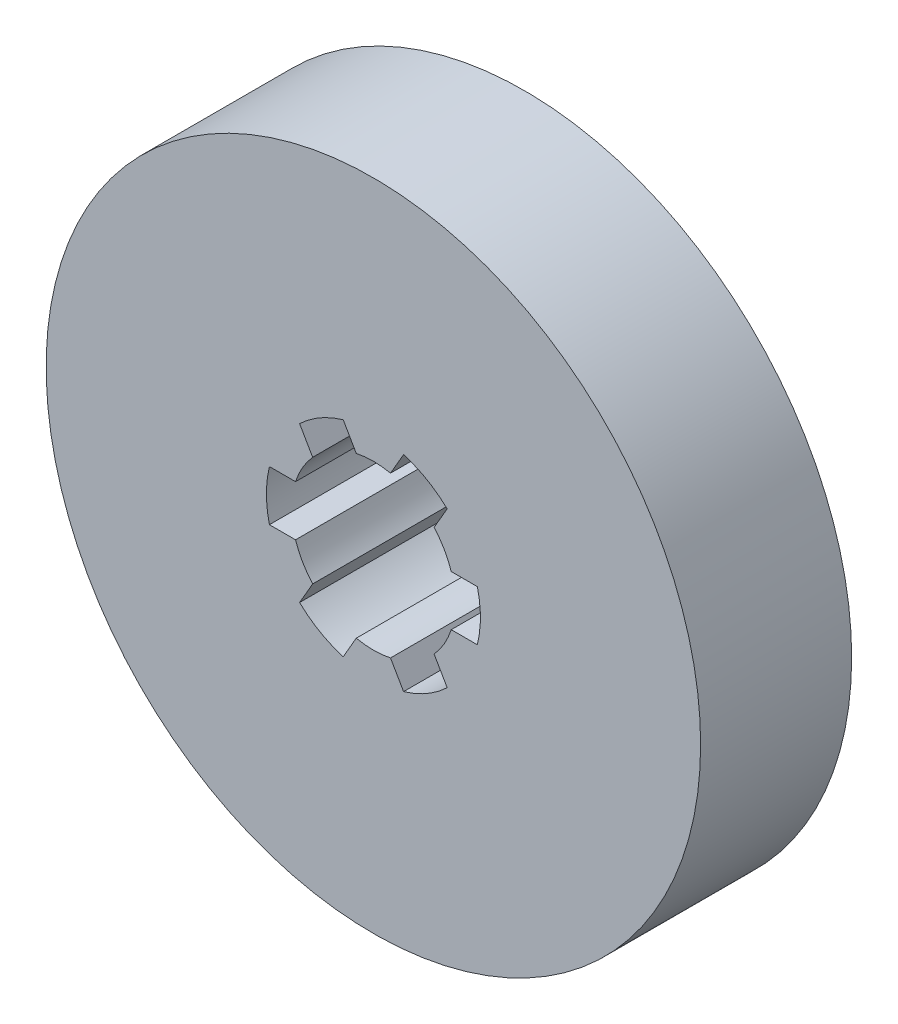
ISO-10303-21;
HEADER;
FILE_DESCRIPTION(('STEP AP214'),'2;1');
FILE_NAME('part.step','',(''),(''),'','','');
FILE_SCHEMA(('AUTOMOTIVE_DESIGN { 1 0 10303 214 1 1 1 1 }'));
ENDSEC;
DATA;
#1=APPLICATION_CONTEXT('core data for automotive mechanical design processes');
#2=APPLICATION_PROTOCOL_DEFINITION('international standard','automotive_design',2000,#1);
#3=PRODUCT_CONTEXT('',#1,'mechanical');
#4=PRODUCT('Part','Part','',(#3));
#5=PRODUCT_RELATED_PRODUCT_CATEGORY('part','',(#4));
#6=PRODUCT_DEFINITION_FORMATION('','',#4);
#7=PRODUCT_DEFINITION_CONTEXT('part definition',#1,'design');
#8=PRODUCT_DEFINITION('design','',#6,#7);
#9=PRODUCT_DEFINITION_SHAPE('','',#8);
#10=(LENGTH_UNIT() NAMED_UNIT(*) SI_UNIT(.MILLI.,.METRE.));
#11=(NAMED_UNIT(*) PLANE_ANGLE_UNIT() SI_UNIT($,.RADIAN.));
#12=(NAMED_UNIT(*) SI_UNIT($,.STERADIAN.) SOLID_ANGLE_UNIT());
#13=UNCERTAINTY_MEASURE_WITH_UNIT(LENGTH_MEASURE(1.E-05),#10,'distance_accuracy_value','');
#14=(GEOMETRIC_REPRESENTATION_CONTEXT(3) GLOBAL_UNCERTAINTY_ASSIGNED_CONTEXT((#13)) GLOBAL_UNIT_ASSIGNED_CONTEXT((#10,
#11,#12)) REPRESENTATION_CONTEXT('',''));
#15=CARTESIAN_POINT('',(0.,0.,0.));
#16=DIRECTION('',(0.,0.,1.));
#17=DIRECTION('',(1.,0.,0.));
#18=AXIS2_PLACEMENT_3D('',#15,#16,#17);
#19=CARTESIAN_POINT('',(0.,0.,12.));
#20=DIRECTION('',(0.,0.,1.));
#21=DIRECTION('',(1.,0.,0.));
#22=AXIS2_PLACEMENT_3D('',#19,#20,#21);
#23=PLANE('',#22);
#24=CARTESIAN_POINT('',(0.,0.,12.));
#25=DIRECTION('',(0.,0.,1.));
#26=DIRECTION('',(1.,0.,0.));
#27=AXIS2_PLACEMENT_3D('',#24,#25,#26);
#28=CIRCLE('',#27,26.);
#29=CARTESIAN_POINT('',(26.,0.,12.));
#30=VERTEX_POINT('',#29);
#31=EDGE_CURVE('E10',#30,#30,#28,.T.);
#32=ORIENTED_EDGE('',*,*,#31,.T.);
#33=EDGE_LOOP('',(#32));
#34=FACE_BOUND('',#33,.T.);
#35=CARTESIAN_POINT('',(1.41538913929051E-05,0.000114129818460512,12.));
#36=DIRECTION('',(0.,0.,1.));
#37=DIRECTION('',(1.,0.,0.));
#38=AXIS2_PLACEMENT_3D('',#35,#36,#37);
#39=CIRCLE('',#38,6.5);
#40=CARTESIAN_POINT('',(1.36029256553576,6.35618545122562,12.));
#41=VERTEX_POINT('',#40);
#42=CARTESIAN_POINT('',(-1.36026425775297,6.35618545122562,12.));
#43=VERTEX_POINT('',#42);
#44=EDGE_CURVE('E423',#41,#43,#39,.T.);
#45=ORIENTED_EDGE('',*,*,#44,.F.);
#46=DIRECTION('',(0.5,0.866025403784439,0.));
#47=VECTOR('',#46,1.);
#48=CARTESIAN_POINT('',(1.87946691116143,7.2554217958356,12.));
#49=LINE('',#48,#47);
#50=CARTESIAN_POINT('',(2.3986412567871,8.15465814044558,12.));
#51=VERTEX_POINT('',#50);
#52=EDGE_CURVE('E233',#41,#51,#49,.T.);
#53=ORIENTED_EDGE('',*,*,#52,.T.);
#54=CARTESIAN_POINT('',(1.4153891405265E-05,0.000114129818509518,12.));
#55=DIRECTION('',(0.,0.,1.));
#56=DIRECTION('',(1.,0.,0.));
#57=AXIS2_PLACEMENT_3D('',#54,#55,#56);
#58=CIRCLE('',#57,8.5);
#59=CARTESIAN_POINT('',(5.86274287192485,6.15465814044558,12.));
#60=VERTEX_POINT('',#59);
#61=EDGE_CURVE('E351',#60,#51,#58,.T.);
#62=ORIENTED_EDGE('',*,*,#61,.F.);
#63=DIRECTION('',(0.5,0.866025403784439,0.));
#64=VECTOR('',#63,1.);
#65=CARTESIAN_POINT('',(5.34356852629918,5.2554217958356,12.));
#66=LINE('',#65,#64);
#67=CARTESIAN_POINT('',(4.82439418067351,4.35618545122562,12.));
#68=VERTEX_POINT('',#67);
#69=EDGE_CURVE('E37',#68,#60,#66,.T.);
#70=ORIENTED_EDGE('',*,*,#69,.F.);
#71=CARTESIAN_POINT('',(1.41538913857493E-05,0.000114129818478944,12.));
#72=DIRECTION('',(0.,0.,1.));
#73=DIRECTION('',(1.,0.,0.));
#74=AXIS2_PLACEMENT_3D('',#71,#72,#73);
#75=CIRCLE('',#74,6.5);
#76=CARTESIAN_POINT('',(6.18467259231788,2.00011412981848,12.));
#77=VERTEX_POINT('',#76);
#78=EDGE_CURVE('E419',#77,#68,#75,.T.);
#79=ORIENTED_EDGE('',*,*,#78,.F.);
#80=DIRECTION('',(1.,0.,0.));
#81=VECTOR('',#80,1.);
#82=CARTESIAN_POINT('',(7.22302128356921,2.00011412981848,12.));
#83=LINE('',#82,#81);
#84=CARTESIAN_POINT('',(8.26136997482055,2.00011412981848,12.));
#85=VERTEX_POINT('',#84);
#86=EDGE_CURVE('E403',#77,#85,#83,.T.);
#87=ORIENTED_EDGE('',*,*,#86,.T.);
#88=CARTESIAN_POINT('',(1.41538913844483E-05,0.000114129818484581,12.));
#89=DIRECTION('',(0.,0.,1.));
#90=DIRECTION('',(1.,0.,0.));
#91=AXIS2_PLACEMENT_3D('',#88,#89,#90);
#92=CIRCLE('',#91,8.5);
#93=CARTESIAN_POINT('',(8.26136997482055,-1.99988587018151,12.));
#94=VERTEX_POINT('',#93);
#95=EDGE_CURVE('E411',#94,#85,#92,.T.);
#96=ORIENTED_EDGE('',*,*,#95,.F.);
#97=DIRECTION('',(1.,0.,0.));
#98=VECTOR('',#97,1.);
#99=CARTESIAN_POINT('',(7.22302128356921,-1.99988587018151,12.));
#100=LINE('',#99,#98);
#101=CARTESIAN_POINT('',(6.18467259231788,-1.99988587018151,12.));
#102=VERTEX_POINT('',#101);
#103=EDGE_CURVE('E407',#102,#94,#100,.T.);
#104=ORIENTED_EDGE('',*,*,#103,.F.);
#105=CARTESIAN_POINT('',(1.41538913853156E-05,0.000114129818493038,12.));
#106=DIRECTION('',(0.,0.,1.));
#107=DIRECTION('',(1.,0.,0.));
#108=AXIS2_PLACEMENT_3D('',#105,#106,#107);
#109=CIRCLE('',#108,6.5);
#110=CARTESIAN_POINT('',(4.82439418067352,-4.35595719158865,12.));
#111=VERTEX_POINT('',#110);
#112=EDGE_CURVE('E415',#111,#102,#109,.T.);
#113=ORIENTED_EDGE('',*,*,#112,.F.);
#114=DIRECTION('',(0.5,-0.866025403784439,0.));
#115=VECTOR('',#114,1.);
#116=CARTESIAN_POINT('',(5.34356852629918,-5.25519353619863,12.));
#117=LINE('',#116,#115);
#118=CARTESIAN_POINT('',(5.86274287192485,-6.15442988080861,12.));
#119=VERTEX_POINT('',#118);
#120=EDGE_CURVE('E399',#111,#119,#117,.T.);
#121=ORIENTED_EDGE('',*,*,#120,.T.);
#122=CARTESIAN_POINT('',(1.41538914030966E-05,0.000114129818468318,12.));
#123=DIRECTION('',(0.,0.,1.));
#124=DIRECTION('',(1.,0.,0.));
#125=AXIS2_PLACEMENT_3D('',#122,#123,#124);
#126=CIRCLE('',#125,8.5);
#127=CARTESIAN_POINT('',(2.39864125678709,-8.15442988080861,12.));
#128=VERTEX_POINT('',#127);
#129=EDGE_CURVE('E395',#128,#119,#126,.T.);
#130=ORIENTED_EDGE('',*,*,#129,.F.);
#131=DIRECTION('',(0.5,-0.866025403784439,0.));
#132=VECTOR('',#131,1.);
#133=CARTESIAN_POINT('',(1.87946691116143,-7.25519353619863,12.));
#134=LINE('',#133,#132);
#135=CARTESIAN_POINT('',(1.36029256553576,-6.35595719158865,12.));
#136=VERTEX_POINT('',#135);
#137=EDGE_CURVE('E391',#136,#128,#134,.T.);
#138=ORIENTED_EDGE('',*,*,#137,.F.);
#139=CARTESIAN_POINT('',(1.41538913914956E-05,0.000114129818493038,12.));
#140=DIRECTION('',(0.,0.,1.));
#141=DIRECTION('',(1.,0.,0.));
#142=AXIS2_PLACEMENT_3D('',#139,#140,#141);
#143=CIRCLE('',#142,6.5);
#144=CARTESIAN_POINT('',(-1.36026425775298,-6.35595719158865,12.));
#145=VERTEX_POINT('',#144);
#146=EDGE_CURVE('E257',#145,#136,#143,.T.);
#147=ORIENTED_EDGE('',*,*,#146,.F.);
#148=DIRECTION('',(-0.5,-0.866025403784439,0.));
#149=VECTOR('',#148,1.);
#150=CARTESIAN_POINT('',(-1.87943860337864,-7.25519353619863,12.));
#151=LINE('',#150,#149);
#152=CARTESIAN_POINT('',(-2.39861294900431,-8.15442988080861,12.));
#153=VERTEX_POINT('',#152);
#154=EDGE_CURVE('E379',#145,#153,#151,.T.);
#155=ORIENTED_EDGE('',*,*,#154,.T.);
#156=CARTESIAN_POINT('',(1.41538913814125E-05,0.000114129818462247,12.));
#157=DIRECTION('',(0.,0.,1.));
#158=DIRECTION('',(1.,0.,0.));
#159=AXIS2_PLACEMENT_3D('',#156,#157,#158);
#160=CIRCLE('',#159,8.5);
#161=CARTESIAN_POINT('',(-5.86271456414206,-6.15442988080861,12.));
#162=VERTEX_POINT('',#161);
#163=EDGE_CURVE('E387',#162,#153,#160,.T.);
#164=ORIENTED_EDGE('',*,*,#163,.F.);
#165=DIRECTION('',(-0.5,-0.866025403784439,0.));
#166=VECTOR('',#165,1.);
#167=CARTESIAN_POINT('',(-5.3435402185164,-5.25519353619863,12.));
#168=LINE('',#167,#166);
#169=CARTESIAN_POINT('',(-4.82436587289073,-4.35595719158865,12.));
#170=VERTEX_POINT('',#169);
#171=EDGE_CURVE('E383',#170,#162,#168,.T.);
#172=ORIENTED_EDGE('',*,*,#171,.F.);
#173=CARTESIAN_POINT('',(1.41538913610295E-05,0.000114129818467017,12.));
#174=DIRECTION('',(0.,0.,1.));
#175=DIRECTION('',(1.,0.,0.));
#176=AXIS2_PLACEMENT_3D('',#173,#174,#175);
#177=CIRCLE('',#176,6.5);
#178=CARTESIAN_POINT('',(-6.1846442845351,-1.99988587018151,12.));
#179=VERTEX_POINT('',#178);
#180=EDGE_CURVE('E266',#179,#170,#177,.T.);
#181=ORIENTED_EDGE('',*,*,#180,.F.);
#182=DIRECTION('',(-1.,0.,0.));
#183=VECTOR('',#182,1.);
#184=CARTESIAN_POINT('',(-7.22299297578643,-1.99988587018151,12.));
#185=LINE('',#184,#183);
#186=CARTESIAN_POINT('',(-8.26134166703776,-1.99988587018151,12.));
#187=VERTEX_POINT('',#186);
#188=EDGE_CURVE('E375',#179,#187,#185,.T.);
#189=ORIENTED_EDGE('',*,*,#188,.T.);
#190=CARTESIAN_POINT('',(1.41538913714378E-05,0.000114129818484148,12.));
#191=DIRECTION('',(0.,0.,1.));
#192=DIRECTION('',(1.,0.,0.));
#193=AXIS2_PLACEMENT_3D('',#190,#191,#192);
#194=CIRCLE('',#193,8.5);
#195=CARTESIAN_POINT('',(-8.26134166703776,2.00011412981848,12.));
#196=VERTEX_POINT('',#195);
#197=EDGE_CURVE('E371',#196,#187,#194,.T.);
#198=ORIENTED_EDGE('',*,*,#197,.F.);
#199=DIRECTION('',(-1.,0.,0.));
#200=VECTOR('',#199,1.);
#201=CARTESIAN_POINT('',(-7.22299297578643,2.00011412981848,12.));
#202=LINE('',#201,#200);
#203=CARTESIAN_POINT('',(-6.1846442845351,2.00011412981848,12.));
#204=VERTEX_POINT('',#203);
#205=EDGE_CURVE('E367',#204,#196,#202,.T.);
#206=ORIENTED_EDGE('',*,*,#205,.F.);
#207=CARTESIAN_POINT('',(1.4153891375341E-05,0.000114129818493255,12.));
#208=DIRECTION('',(0.,0.,1.));
#209=DIRECTION('',(1.,0.,0.));
#210=AXIS2_PLACEMENT_3D('',#207,#208,#209);
#211=CIRCLE('',#210,6.5);
#212=CARTESIAN_POINT('',(-4.82436587289073,4.35618545122562,12.));
#213=VERTEX_POINT('',#212);
#214=EDGE_CURVE('E426',#213,#204,#211,.T.);
#215=ORIENTED_EDGE('',*,*,#214,.F.);
#216=DIRECTION('',(-0.5,0.866025403784439,0.));
#217=VECTOR('',#216,1.);
#218=CARTESIAN_POINT('',(-5.3435402185164,5.2554217958356,12.));
#219=LINE('',#218,#217);
#220=CARTESIAN_POINT('',(-5.86271456414206,6.15465814044558,12.));
#221=VERTEX_POINT('',#220);
#222=EDGE_CURVE('E355',#213,#221,#219,.T.);
#223=ORIENTED_EDGE('',*,*,#222,.T.);
#224=CARTESIAN_POINT('',(1.41538913857493E-05,0.00011412981849564,12.));
#225=DIRECTION('',(0.,0.,1.));
#226=DIRECTION('',(1.,0.,0.));
#227=AXIS2_PLACEMENT_3D('',#224,#225,#226);
#228=CIRCLE('',#227,8.5);
#229=CARTESIAN_POINT('',(-2.39861294900431,8.15465814044558,12.));
#230=VERTEX_POINT('',#229);
#231=EDGE_CURVE('E363',#230,#221,#228,.T.);
#232=ORIENTED_EDGE('',*,*,#231,.F.);
#233=DIRECTION('',(-0.5,0.866025403784439,0.));
#234=VECTOR('',#233,1.);
#235=CARTESIAN_POINT('',(-1.87943860337864,7.2554217958356,12.));
#236=LINE('',#235,#234);
#237=EDGE_CURVE('E359',#43,#230,#236,.T.);
#238=ORIENTED_EDGE('',*,*,#237,.F.);
#239=EDGE_LOOP('',(#45,#53,#62,#70,#79,#87,#96,#104,#113,#121,#130,#138,#147,#155,#164,#172,
#181,#189,#198,#206,#215,#223,#232,#238));
#240=FACE_BOUND('',#239,.T.);
#241=ADVANCED_FACE('F16',(#34,#240),#23,.T.);
#242=CARTESIAN_POINT('',(0.,0.,0.));
#243=DIRECTION('',(0.,0.,1.));
#244=DIRECTION('',(1.,0.,0.));
#245=AXIS2_PLACEMENT_3D('',#242,#243,#244);
#246=PLANE('',#245);
#247=CARTESIAN_POINT('',(0.,0.,0.));
#248=DIRECTION('',(0.,0.,1.));
#249=DIRECTION('',(1.,0.,0.));
#250=AXIS2_PLACEMENT_3D('',#247,#248,#249);
#251=CIRCLE('',#250,26.);
#252=CARTESIAN_POINT('',(26.,0.,0.));
#253=VERTEX_POINT('',#252);
#254=EDGE_CURVE('E20',#253,#253,#251,.T.);
#255=ORIENTED_EDGE('',*,*,#254,.F.);
#256=EDGE_LOOP('',(#255));
#257=FACE_BOUND('',#256,.T.);
#258=DIRECTION('',(0.5,0.866025403784439,0.));
#259=VECTOR('',#258,1.);
#260=CARTESIAN_POINT('',(1.87946691116143,7.2554217958356,0.));
#261=LINE('',#260,#259);
#262=CARTESIAN_POINT('',(1.36029256553576,6.35618545122562,0.));
#263=VERTEX_POINT('',#262);
#264=CARTESIAN_POINT('',(2.3986412567871,8.15465814044558,0.));
#265=VERTEX_POINT('',#264);
#266=EDGE_CURVE('E49',#263,#265,#261,.T.);
#267=ORIENTED_EDGE('',*,*,#266,.F.);
#268=CARTESIAN_POINT('',(1.41538913929051E-05,0.000114129818460512,0.));
#269=DIRECTION('',(0.,0.,1.));
#270=DIRECTION('',(1.,0.,0.));
#271=AXIS2_PLACEMENT_3D('',#268,#269,#270);
#272=CIRCLE('',#271,6.5);
#273=CARTESIAN_POINT('',(-1.36026425775297,6.35618545122562,0.));
#274=VERTEX_POINT('',#273);
#275=EDGE_CURVE('E241',#263,#274,#272,.T.);
#276=ORIENTED_EDGE('',*,*,#275,.T.);
#277=DIRECTION('',(-0.5,0.866025403784439,0.));
#278=VECTOR('',#277,1.);
#279=CARTESIAN_POINT('',(-1.87943860337864,7.2554217958356,0.));
#280=LINE('',#279,#278);
#281=CARTESIAN_POINT('',(-2.39861294900431,8.15465814044558,0.));
#282=VERTEX_POINT('',#281);
#283=EDGE_CURVE('E275',#274,#282,#280,.T.);
#284=ORIENTED_EDGE('',*,*,#283,.T.);
#285=CARTESIAN_POINT('',(1.41538913857493E-05,0.00011412981849564,0.));
#286=DIRECTION('',(0.,0.,1.));
#287=DIRECTION('',(1.,0.,0.));
#288=AXIS2_PLACEMENT_3D('',#285,#286,#287);
#289=CIRCLE('',#288,8.5);
#290=CARTESIAN_POINT('',(-5.86271456414206,6.15465814044558,0.));
#291=VERTEX_POINT('',#290);
#292=EDGE_CURVE('E278',#282,#291,#289,.T.);
#293=ORIENTED_EDGE('',*,*,#292,.T.);
#294=DIRECTION('',(-0.5,0.866025403784439,0.));
#295=VECTOR('',#294,1.);
#296=CARTESIAN_POINT('',(-5.3435402185164,5.2554217958356,0.));
#297=LINE('',#296,#295);
#298=CARTESIAN_POINT('',(-4.82436587289073,4.35618545122562,0.));
#299=VERTEX_POINT('',#298);
#300=EDGE_CURVE('E271',#299,#291,#297,.T.);
#301=ORIENTED_EDGE('',*,*,#300,.F.);
#302=CARTESIAN_POINT('',(1.4153891375341E-05,0.000114129818493255,0.));
#303=DIRECTION('',(0.,0.,1.));
#304=DIRECTION('',(1.,0.,0.));
#305=AXIS2_PLACEMENT_3D('',#302,#303,#304);
#306=CIRCLE('',#305,6.5);
#307=CARTESIAN_POINT('',(-6.1846442845351,2.00011412981848,0.));
#308=VERTEX_POINT('',#307);
#309=EDGE_CURVE('E247',#299,#308,#306,.T.);
#310=ORIENTED_EDGE('',*,*,#309,.T.);
#311=DIRECTION('',(-1.,0.,0.));
#312=VECTOR('',#311,1.);
#313=CARTESIAN_POINT('',(-7.22299297578643,2.00011412981848,0.));
#314=LINE('',#313,#312);
#315=CARTESIAN_POINT('',(-8.26134166703776,2.00011412981848,0.));
#316=VERTEX_POINT('',#315);
#317=EDGE_CURVE('E282',#308,#316,#314,.T.);
#318=ORIENTED_EDGE('',*,*,#317,.T.);
#319=CARTESIAN_POINT('',(1.41538913714378E-05,0.000114129818484148,0.));
#320=DIRECTION('',(0.,0.,1.));
#321=DIRECTION('',(1.,0.,0.));
#322=AXIS2_PLACEMENT_3D('',#319,#320,#321);
#323=CIRCLE('',#322,8.5);
#324=CARTESIAN_POINT('',(-8.26134166703776,-1.99988587018151,0.));
#325=VERTEX_POINT('',#324);
#326=EDGE_CURVE('E286',#316,#325,#323,.T.);
#327=ORIENTED_EDGE('',*,*,#326,.T.);
#328=DIRECTION('',(-1.,0.,0.));
#329=VECTOR('',#328,1.);
#330=CARTESIAN_POINT('',(-7.22299297578643,-1.99988587018151,0.));
#331=LINE('',#330,#329);
#332=CARTESIAN_POINT('',(-6.1846442845351,-1.99988587018151,0.));
#333=VERTEX_POINT('',#332);
#334=EDGE_CURVE('E290',#333,#325,#331,.T.);
#335=ORIENTED_EDGE('',*,*,#334,.F.);
#336=CARTESIAN_POINT('',(1.41538913610295E-05,0.000114129818467017,0.));
#337=DIRECTION('',(0.,0.,1.));
#338=DIRECTION('',(1.,0.,0.));
#339=AXIS2_PLACEMENT_3D('',#336,#337,#338);
#340=CIRCLE('',#339,6.5);
#341=CARTESIAN_POINT('',(-4.82436587289073,-4.35595719158865,0.));
#342=VERTEX_POINT('',#341);
#343=EDGE_CURVE('E340',#333,#342,#340,.T.);
#344=ORIENTED_EDGE('',*,*,#343,.T.);
#345=DIRECTION('',(-0.5,-0.866025403784439,0.));
#346=VECTOR('',#345,1.);
#347=CARTESIAN_POINT('',(-5.3435402185164,-5.25519353619863,0.));
#348=LINE('',#347,#346);
#349=CARTESIAN_POINT('',(-5.86271456414206,-6.15442988080861,0.));
#350=VERTEX_POINT('',#349);
#351=EDGE_CURVE('E298',#342,#350,#348,.T.);
#352=ORIENTED_EDGE('',*,*,#351,.T.);
#353=CARTESIAN_POINT('',(1.41538913814125E-05,0.000114129818462247,0.));
#354=DIRECTION('',(0.,0.,1.));
#355=DIRECTION('',(1.,0.,0.));
#356=AXIS2_PLACEMENT_3D('',#353,#354,#355);
#357=CIRCLE('',#356,8.5);
#358=CARTESIAN_POINT('',(-2.39861294900431,-8.15442988080861,0.));
#359=VERTEX_POINT('',#358);
#360=EDGE_CURVE('E302',#350,#359,#357,.T.);
#361=ORIENTED_EDGE('',*,*,#360,.T.);
#362=DIRECTION('',(-0.5,-0.866025403784439,0.));
#363=VECTOR('',#362,1.);
#364=CARTESIAN_POINT('',(-1.87943860337864,-7.25519353619863,0.));
#365=LINE('',#364,#363);
#366=CARTESIAN_POINT('',(-1.36026425775298,-6.35595719158865,0.));
#367=VERTEX_POINT('',#366);
#368=EDGE_CURVE('E294',#367,#359,#365,.T.);
#369=ORIENTED_EDGE('',*,*,#368,.F.);
#370=CARTESIAN_POINT('',(1.41538913914956E-05,0.000114129818493038,0.));
#371=DIRECTION('',(0.,0.,1.));
#372=DIRECTION('',(1.,0.,0.));
#373=AXIS2_PLACEMENT_3D('',#370,#371,#372);
#374=CIRCLE('',#373,6.5);
#375=CARTESIAN_POINT('',(1.36029256553576,-6.35595719158865,0.));
#376=VERTEX_POINT('',#375);
#377=EDGE_CURVE('E344',#367,#376,#374,.T.);
#378=ORIENTED_EDGE('',*,*,#377,.T.);
#379=DIRECTION('',(0.5,-0.866025403784439,0.));
#380=VECTOR('',#379,1.);
#381=CARTESIAN_POINT('',(1.87946691116143,-7.25519353619863,0.));
#382=LINE('',#381,#380);
#383=CARTESIAN_POINT('',(2.39864125678709,-8.15442988080861,0.));
#384=VERTEX_POINT('',#383);
#385=EDGE_CURVE('E306',#376,#384,#382,.T.);
#386=ORIENTED_EDGE('',*,*,#385,.T.);
#387=CARTESIAN_POINT('',(1.41538914030966E-05,0.000114129818468318,0.));
#388=DIRECTION('',(0.,0.,1.));
#389=DIRECTION('',(1.,0.,0.));
#390=AXIS2_PLACEMENT_3D('',#387,#388,#389);
#391=CIRCLE('',#390,8.5);
#392=CARTESIAN_POINT('',(5.86274287192485,-6.15442988080861,0.));
#393=VERTEX_POINT('',#392);
#394=EDGE_CURVE('E310',#384,#393,#391,.T.);
#395=ORIENTED_EDGE('',*,*,#394,.T.);
#396=DIRECTION('',(0.5,-0.866025403784439,0.));
#397=VECTOR('',#396,1.);
#398=CARTESIAN_POINT('',(5.34356852629918,-5.25519353619863,0.));
#399=LINE('',#398,#397);
#400=CARTESIAN_POINT('',(4.82439418067352,-4.35595719158865,0.));
#401=VERTEX_POINT('',#400);
#402=EDGE_CURVE('E314',#401,#393,#399,.T.);
#403=ORIENTED_EDGE('',*,*,#402,.F.);
#404=CARTESIAN_POINT('',(1.41538913853156E-05,0.000114129818493038,0.));
#405=DIRECTION('',(0.,0.,1.));
#406=DIRECTION('',(1.,0.,0.));
#407=AXIS2_PLACEMENT_3D('',#404,#405,#406);
#408=CIRCLE('',#407,6.5);
#409=CARTESIAN_POINT('',(6.18467259231788,-1.99988587018151,0.));
#410=VERTEX_POINT('',#409);
#411=EDGE_CURVE('E330',#401,#410,#408,.T.);
#412=ORIENTED_EDGE('',*,*,#411,.T.);
#413=DIRECTION('',(1.,0.,0.));
#414=VECTOR('',#413,1.);
#415=CARTESIAN_POINT('',(7.22302128356921,-1.99988587018151,0.));
#416=LINE('',#415,#414);
#417=CARTESIAN_POINT('',(8.26136997482055,-1.99988587018151,0.));
#418=VERTEX_POINT('',#417);
#419=EDGE_CURVE('E322',#410,#418,#416,.T.);
#420=ORIENTED_EDGE('',*,*,#419,.T.);
#421=CARTESIAN_POINT('',(1.41538913844483E-05,0.000114129818484581,0.));
#422=DIRECTION('',(0.,0.,1.));
#423=DIRECTION('',(1.,0.,0.));
#424=AXIS2_PLACEMENT_3D('',#421,#422,#423);
#425=CIRCLE('',#424,8.5);
#426=CARTESIAN_POINT('',(8.26136997482055,2.00011412981848,0.));
#427=VERTEX_POINT('',#426);
#428=EDGE_CURVE('E326',#418,#427,#425,.T.);
#429=ORIENTED_EDGE('',*,*,#428,.T.);
#430=DIRECTION('',(1.,0.,0.));
#431=VECTOR('',#430,1.);
#432=CARTESIAN_POINT('',(7.22302128356921,2.00011412981848,0.));
#433=LINE('',#432,#431);
#434=CARTESIAN_POINT('',(6.18467259231788,2.00011412981848,0.));
#435=VERTEX_POINT('',#434);
#436=EDGE_CURVE('E318',#435,#427,#433,.T.);
#437=ORIENTED_EDGE('',*,*,#436,.F.);
#438=CARTESIAN_POINT('',(1.41538913857493E-05,0.000114129818478944,0.));
#439=DIRECTION('',(0.,0.,1.));
#440=DIRECTION('',(1.,0.,0.));
#441=AXIS2_PLACEMENT_3D('',#438,#439,#440);
#442=CIRCLE('',#441,6.5);
#443=CARTESIAN_POINT('',(4.82439418067351,4.35618545122562,0.));
#444=VERTEX_POINT('',#443);
#445=EDGE_CURVE('E248',#435,#444,#442,.T.);
#446=ORIENTED_EDGE('',*,*,#445,.T.);
#447=DIRECTION('',(0.5,0.866025403784439,0.));
#448=VECTOR('',#447,1.);
#449=CARTESIAN_POINT('',(5.34356852629918,5.2554217958356,0.));
#450=LINE('',#449,#448);
#451=CARTESIAN_POINT('',(5.86274287192485,6.15465814044558,0.));
#452=VERTEX_POINT('',#451);
#453=EDGE_CURVE('E256',#444,#452,#450,.T.);
#454=ORIENTED_EDGE('',*,*,#453,.T.);
#455=CARTESIAN_POINT('',(1.4153891405265E-05,0.000114129818509518,0.));
#456=DIRECTION('',(0.,0.,1.));
#457=DIRECTION('',(1.,0.,0.));
#458=AXIS2_PLACEMENT_3D('',#455,#456,#457);
#459=CIRCLE('',#458,8.5);
#460=EDGE_CURVE('E254',#452,#265,#459,.T.);
#461=ORIENTED_EDGE('',*,*,#460,.T.);
#462=EDGE_LOOP('',(#267,#276,#284,#293,#301,#310,#318,#327,#335,#344,#352,#361,#369,#378,#386,
#395,#403,#412,#420,#429,#437,#446,#454,#461));
#463=FACE_BOUND('',#462,.T.);
#464=ADVANCED_FACE('F251',(#257,#463),#246,.F.);
#465=CARTESIAN_POINT('',(0.,0.,12.));
#466=DIRECTION('',(0.,0.,-1.));
#467=DIRECTION('',(-1.,0.,0.));
#468=AXIS2_PLACEMENT_3D('',#465,#466,#467);
#469=CYLINDRICAL_SURFACE('',#468,26.);
#470=ORIENTED_EDGE('',*,*,#31,.F.);
#471=EDGE_LOOP('',(#470));
#472=FACE_BOUND('',#471,.T.);
#473=ORIENTED_EDGE('',*,*,#254,.T.);
#474=EDGE_LOOP('',(#473));
#475=FACE_BOUND('',#474,.T.);
#476=ADVANCED_FACE('F18',(#472,#475),#469,.T.);
#477=CARTESIAN_POINT('',(1.87946691116143,7.2554217958356,0.));
#478=DIRECTION('',(0.866025403784438,-0.5,0.));
#479=DIRECTION('',(0.5,0.866025403784439,0.));
#480=AXIS2_PLACEMENT_3D('',#477,#478,#479);
#481=PLANE('',#480);
#482=ORIENTED_EDGE('',*,*,#52,.F.);
#483=DIRECTION('',(0.,0.,1.));
#484=VECTOR('',#483,1.);
#485=CARTESIAN_POINT('',(1.36029256553576,6.35618545122562,0.));
#486=LINE('',#485,#484);
#487=EDGE_CURVE('E229',#263,#41,#486,.T.);
#488=ORIENTED_EDGE('',*,*,#487,.F.);
#489=ORIENTED_EDGE('',*,*,#266,.T.);
#490=DIRECTION('',(0.,0.,1.));
#491=VECTOR('',#490,1.);
#492=CARTESIAN_POINT('',(2.3986412567871,8.15465814044558,0.));
#493=LINE('',#492,#491);
#494=EDGE_CURVE('E348',#265,#51,#493,.T.);
#495=ORIENTED_EDGE('',*,*,#494,.T.);
#496=EDGE_LOOP('',(#482,#488,#489,#495));
#497=FACE_BOUND('',#496,.T.);
#498=ADVANCED_FACE('F231',(#497),#481,.T.);
#499=CARTESIAN_POINT('',(1.41538913929051E-05,0.000114129818460512,0.));
#500=DIRECTION('',(0.,0.,1.));
#501=DIRECTION('',(1.,0.,0.));
#502=AXIS2_PLACEMENT_3D('',#499,#500,#501);
#503=CYLINDRICAL_SURFACE('',#502,6.5);
#504=ORIENTED_EDGE('',*,*,#44,.T.);
#505=DIRECTION('',(0.,0.,1.));
#506=VECTOR('',#505,1.);
#507=CARTESIAN_POINT('',(-1.36026425775297,6.35618545122562,0.));
#508=LINE('',#507,#506);
#509=EDGE_CURVE('E238',#274,#43,#508,.T.);
#510=ORIENTED_EDGE('',*,*,#509,.F.);
#511=ORIENTED_EDGE('',*,*,#275,.F.);
#512=ORIENTED_EDGE('',*,*,#487,.T.);
#513=EDGE_LOOP('',(#504,#510,#511,#512));
#514=FACE_BOUND('',#513,.T.);
#515=ADVANCED_FACE('F242',(#514),#503,.F.);
#516=CARTESIAN_POINT('',(-1.87943860337864,7.2554217958356,0.));
#517=DIRECTION('',(0.866025403784439,0.5,0.));
#518=DIRECTION('',(-0.5,0.866025403784439,0.));
#519=AXIS2_PLACEMENT_3D('',#516,#517,#518);
#520=PLANE('',#519);
#521=ORIENTED_EDGE('',*,*,#237,.T.);
#522=DIRECTION('',(0.,0.,1.));
#523=VECTOR('',#522,1.);
#524=CARTESIAN_POINT('',(-2.39861294900431,8.15465814044558,0.));
#525=LINE('',#524,#523);
#526=EDGE_CURVE('E486',#282,#230,#525,.T.);
#527=ORIENTED_EDGE('',*,*,#526,.F.);
#528=ORIENTED_EDGE('',*,*,#283,.F.);
#529=ORIENTED_EDGE('',*,*,#509,.T.);
#530=EDGE_LOOP('',(#521,#527,#528,#529));
#531=FACE_BOUND('',#530,.T.);
#532=ADVANCED_FACE('F584',(#531),#520,.F.);
#533=CARTESIAN_POINT('',(1.41538913857493E-05,0.00011412981849564,0.));
#534=DIRECTION('',(0.,0.,1.));
#535=DIRECTION('',(1.,0.,0.));
#536=AXIS2_PLACEMENT_3D('',#533,#534,#535);
#537=CYLINDRICAL_SURFACE('',#536,8.5);
#538=ORIENTED_EDGE('',*,*,#231,.T.);
#539=DIRECTION('',(0.,0.,1.));
#540=VECTOR('',#539,1.);
#541=CARTESIAN_POINT('',(-5.86271456414206,6.15465814044558,0.));
#542=LINE('',#541,#540);
#543=EDGE_CURVE('E483',#291,#221,#542,.T.);
#544=ORIENTED_EDGE('',*,*,#543,.F.);
#545=ORIENTED_EDGE('',*,*,#292,.F.);
#546=ORIENTED_EDGE('',*,*,#526,.T.);
#547=EDGE_LOOP('',(#538,#544,#545,#546));
#548=FACE_BOUND('',#547,.T.);
#549=ADVANCED_FACE('F582',(#548),#537,.F.);
#550=CARTESIAN_POINT('',(-5.3435402185164,5.2554217958356,0.));
#551=DIRECTION('',(0.866025403784439,0.5,0.));
#552=DIRECTION('',(-0.5,0.866025403784439,0.));
#553=AXIS2_PLACEMENT_3D('',#550,#551,#552);
#554=PLANE('',#553);
#555=ORIENTED_EDGE('',*,*,#222,.F.);
#556=DIRECTION('',(0.,0.,1.));
#557=VECTOR('',#556,1.);
#558=CARTESIAN_POINT('',(-4.82436587289073,4.35618545122562,0.));
#559=LINE('',#558,#557);
#560=EDGE_CURVE('E482',#299,#213,#559,.T.);
#561=ORIENTED_EDGE('',*,*,#560,.F.);
#562=ORIENTED_EDGE('',*,*,#300,.T.);
#563=ORIENTED_EDGE('',*,*,#543,.T.);
#564=EDGE_LOOP('',(#555,#561,#562,#563));
#565=FACE_BOUND('',#564,.T.);
#566=ADVANCED_FACE('F578',(#565),#554,.T.);
#567=CARTESIAN_POINT('',(1.4153891375341E-05,0.000114129818493255,0.));
#568=DIRECTION('',(0.,0.,1.));
#569=DIRECTION('',(1.,0.,0.));
#570=AXIS2_PLACEMENT_3D('',#567,#568,#569);
#571=CYLINDRICAL_SURFACE('',#570,6.5);
#572=ORIENTED_EDGE('',*,*,#214,.T.);
#573=DIRECTION('',(0.,0.,1.));
#574=VECTOR('',#573,1.);
#575=CARTESIAN_POINT('',(-6.1846442845351,2.00011412981848,0.));
#576=LINE('',#575,#574);
#577=EDGE_CURVE('E479',#308,#204,#576,.T.);
#578=ORIENTED_EDGE('',*,*,#577,.F.);
#579=ORIENTED_EDGE('',*,*,#309,.F.);
#580=ORIENTED_EDGE('',*,*,#560,.T.);
#581=EDGE_LOOP('',(#572,#578,#579,#580));
#582=FACE_BOUND('',#581,.T.);
#583=ADVANCED_FACE('F573',(#582),#571,.F.);
#584=CARTESIAN_POINT('',(-7.22299297578643,2.00011412981848,0.));
#585=DIRECTION('',(0.,1.,0.));
#586=DIRECTION('',(0.,0.,1.));
#587=AXIS2_PLACEMENT_3D('',#584,#585,#586);
#588=PLANE('',#587);
#589=ORIENTED_EDGE('',*,*,#205,.T.);
#590=DIRECTION('',(0.,0.,1.));
#591=VECTOR('',#590,1.);
#592=CARTESIAN_POINT('',(-8.26134166703776,2.00011412981848,0.));
#593=LINE('',#592,#591);
#594=EDGE_CURVE('E476',#316,#196,#593,.T.);
#595=ORIENTED_EDGE('',*,*,#594,.F.);
#596=ORIENTED_EDGE('',*,*,#317,.F.);
#597=ORIENTED_EDGE('',*,*,#577,.T.);
#598=EDGE_LOOP('',(#589,#595,#596,#597));
#599=FACE_BOUND('',#598,.T.);
#600=ADVANCED_FACE('F570',(#599),#588,.F.);
#601=CARTESIAN_POINT('',(1.41538913714378E-05,0.000114129818484148,0.));
#602=DIRECTION('',(0.,0.,1.));
#603=DIRECTION('',(1.,0.,0.));
#604=AXIS2_PLACEMENT_3D('',#601,#602,#603);
#605=CYLINDRICAL_SURFACE('',#604,8.5);
#606=ORIENTED_EDGE('',*,*,#197,.T.);
#607=DIRECTION('',(0.,0.,1.));
#608=VECTOR('',#607,1.);
#609=CARTESIAN_POINT('',(-8.26134166703776,-1.99988587018151,0.));
#610=LINE('',#609,#608);
#611=EDGE_CURVE('E473',#325,#187,#610,.T.);
#612=ORIENTED_EDGE('',*,*,#611,.F.);
#613=ORIENTED_EDGE('',*,*,#326,.F.);
#614=ORIENTED_EDGE('',*,*,#594,.T.);
#615=EDGE_LOOP('',(#606,#612,#613,#614));
#616=FACE_BOUND('',#615,.T.);
#617=ADVANCED_FACE('F566',(#616),#605,.F.);
#618=CARTESIAN_POINT('',(-7.22299297578643,-1.99988587018151,0.));
#619=DIRECTION('',(0.,1.,0.));
#620=DIRECTION('',(0.,0.,1.));
#621=AXIS2_PLACEMENT_3D('',#618,#619,#620);
#622=PLANE('',#621);
#623=ORIENTED_EDGE('',*,*,#188,.F.);
#624=DIRECTION('',(0.,0.,1.));
#625=VECTOR('',#624,1.);
#626=CARTESIAN_POINT('',(-6.1846442845351,-1.99988587018151,0.));
#627=LINE('',#626,#625);
#628=EDGE_CURVE('E468',#333,#179,#627,.T.);
#629=ORIENTED_EDGE('',*,*,#628,.F.);
#630=ORIENTED_EDGE('',*,*,#334,.T.);
#631=ORIENTED_EDGE('',*,*,#611,.T.);
#632=EDGE_LOOP('',(#623,#629,#630,#631));
#633=FACE_BOUND('',#632,.T.);
#634=ADVANCED_FACE('F561',(#633),#622,.T.);
#635=CARTESIAN_POINT('',(1.41538913610295E-05,0.000114129818467017,0.));
#636=DIRECTION('',(0.,0.,1.));
#637=DIRECTION('',(1.,0.,0.));
#638=AXIS2_PLACEMENT_3D('',#635,#636,#637);
#639=CYLINDRICAL_SURFACE('',#638,6.5);
#640=ORIENTED_EDGE('',*,*,#180,.T.);
#641=DIRECTION('',(0.,0.,1.));
#642=VECTOR('',#641,1.);
#643=CARTESIAN_POINT('',(-4.82436587289073,-4.35595719158865,0.));
#644=LINE('',#643,#642);
#645=EDGE_CURVE('E465',#342,#170,#644,.T.);
#646=ORIENTED_EDGE('',*,*,#645,.F.);
#647=ORIENTED_EDGE('',*,*,#343,.F.);
#648=ORIENTED_EDGE('',*,*,#628,.T.);
#649=EDGE_LOOP('',(#640,#646,#647,#648));
#650=FACE_BOUND('',#649,.T.);
#651=ADVANCED_FACE('F557',(#650),#639,.F.);
#652=CARTESIAN_POINT('',(-5.3435402185164,-5.25519353619863,0.));
#653=DIRECTION('',(-0.866025403784438,0.5,0.));
#654=DIRECTION('',(-0.5,-0.866025403784439,0.));
#655=AXIS2_PLACEMENT_3D('',#652,#653,#654);
#656=PLANE('',#655);
#657=ORIENTED_EDGE('',*,*,#171,.T.);
#658=DIRECTION('',(0.,0.,1.));
#659=VECTOR('',#658,1.);
#660=CARTESIAN_POINT('',(-5.86271456414206,-6.15442988080861,0.));
#661=LINE('',#660,#659);
#662=EDGE_CURVE('E462',#350,#162,#661,.T.);
#663=ORIENTED_EDGE('',*,*,#662,.F.);
#664=ORIENTED_EDGE('',*,*,#351,.F.);
#665=ORIENTED_EDGE('',*,*,#645,.T.);
#666=EDGE_LOOP('',(#657,#663,#664,#665));
#667=FACE_BOUND('',#666,.T.);
#668=ADVANCED_FACE('F553',(#667),#656,.F.);
#669=CARTESIAN_POINT('',(1.41538913814125E-05,0.000114129818462247,0.));
#670=DIRECTION('',(0.,0.,1.));
#671=DIRECTION('',(1.,0.,0.));
#672=AXIS2_PLACEMENT_3D('',#669,#670,#671);
#673=CYLINDRICAL_SURFACE('',#672,8.5);
#674=ORIENTED_EDGE('',*,*,#163,.T.);
#675=DIRECTION('',(0.,0.,1.));
#676=VECTOR('',#675,1.);
#677=CARTESIAN_POINT('',(-2.39861294900431,-8.15442988080861,0.));
#678=LINE('',#677,#676);
#679=EDGE_CURVE('E459',#359,#153,#678,.T.);
#680=ORIENTED_EDGE('',*,*,#679,.F.);
#681=ORIENTED_EDGE('',*,*,#360,.F.);
#682=ORIENTED_EDGE('',*,*,#662,.T.);
#683=EDGE_LOOP('',(#674,#680,#681,#682));
#684=FACE_BOUND('',#683,.T.);
#685=ADVANCED_FACE('F549',(#684),#673,.F.);
#686=CARTESIAN_POINT('',(-1.87943860337864,-7.25519353619863,0.));
#687=DIRECTION('',(-0.866025403784438,0.5,0.));
#688=DIRECTION('',(-0.5,-0.866025403784439,0.));
#689=AXIS2_PLACEMENT_3D('',#686,#687,#688);
#690=PLANE('',#689);
#691=ORIENTED_EDGE('',*,*,#154,.F.);
#692=DIRECTION('',(0.,0.,1.));
#693=VECTOR('',#692,1.);
#694=CARTESIAN_POINT('',(-1.36026425775298,-6.35595719158865,0.));
#695=LINE('',#694,#693);
#696=EDGE_CURVE('E458',#367,#145,#695,.T.);
#697=ORIENTED_EDGE('',*,*,#696,.F.);
#698=ORIENTED_EDGE('',*,*,#368,.T.);
#699=ORIENTED_EDGE('',*,*,#679,.T.);
#700=EDGE_LOOP('',(#691,#697,#698,#699));
#701=FACE_BOUND('',#700,.T.);
#702=ADVANCED_FACE('F546',(#701),#690,.T.);
#703=CARTESIAN_POINT('',(1.41538913914956E-05,0.000114129818493038,0.));
#704=DIRECTION('',(0.,0.,1.));
#705=DIRECTION('',(1.,0.,0.));
#706=AXIS2_PLACEMENT_3D('',#703,#704,#705);
#707=CYLINDRICAL_SURFACE('',#706,6.5);
#708=ORIENTED_EDGE('',*,*,#146,.T.);
#709=DIRECTION('',(0.,0.,1.));
#710=VECTOR('',#709,1.);
#711=CARTESIAN_POINT('',(1.36029256553576,-6.35595719158865,0.));
#712=LINE('',#711,#710);
#713=EDGE_CURVE('E455',#376,#136,#712,.T.);
#714=ORIENTED_EDGE('',*,*,#713,.F.);
#715=ORIENTED_EDGE('',*,*,#377,.F.);
#716=ORIENTED_EDGE('',*,*,#696,.T.);
#717=EDGE_LOOP('',(#708,#714,#715,#716));
#718=FACE_BOUND('',#717,.T.);
#719=ADVANCED_FACE('F542',(#718),#707,.F.);
#720=CARTESIAN_POINT('',(1.87946691116143,-7.25519353619863,0.));
#721=DIRECTION('',(-0.866025403784438,-0.5,0.));
#722=DIRECTION('',(0.5,-0.866025403784439,0.));
#723=AXIS2_PLACEMENT_3D('',#720,#721,#722);
#724=PLANE('',#723);
#725=ORIENTED_EDGE('',*,*,#137,.T.);
#726=DIRECTION('',(0.,0.,1.));
#727=VECTOR('',#726,1.);
#728=CARTESIAN_POINT('',(2.39864125678709,-8.15442988080861,0.));
#729=LINE('',#728,#727);
#730=EDGE_CURVE('E452',#384,#128,#729,.T.);
#731=ORIENTED_EDGE('',*,*,#730,.F.);
#732=ORIENTED_EDGE('',*,*,#385,.F.);
#733=ORIENTED_EDGE('',*,*,#713,.T.);
#734=EDGE_LOOP('',(#725,#731,#732,#733));
#735=FACE_BOUND('',#734,.T.);
#736=ADVANCED_FACE('F537',(#735),#724,.F.);
#737=CARTESIAN_POINT('',(1.41538914030966E-05,0.000114129818468318,0.));
#738=DIRECTION('',(0.,0.,1.));
#739=DIRECTION('',(1.,0.,0.));
#740=AXIS2_PLACEMENT_3D('',#737,#738,#739);
#741=CYLINDRICAL_SURFACE('',#740,8.5);
#742=ORIENTED_EDGE('',*,*,#129,.T.);
#743=DIRECTION('',(0.,0.,1.));
#744=VECTOR('',#743,1.);
#745=CARTESIAN_POINT('',(5.86274287192485,-6.15442988080861,0.));
#746=LINE('',#745,#744);
#747=EDGE_CURVE('E449',#393,#119,#746,.T.);
#748=ORIENTED_EDGE('',*,*,#747,.F.);
#749=ORIENTED_EDGE('',*,*,#394,.F.);
#750=ORIENTED_EDGE('',*,*,#730,.T.);
#751=EDGE_LOOP('',(#742,#748,#749,#750));
#752=FACE_BOUND('',#751,.T.);
#753=ADVANCED_FACE('F534',(#752),#741,.F.);
#754=CARTESIAN_POINT('',(5.34356852629918,-5.25519353619863,0.));
#755=DIRECTION('',(-0.866025403784438,-0.5,0.));
#756=DIRECTION('',(0.5,-0.866025403784439,0.));
#757=AXIS2_PLACEMENT_3D('',#754,#755,#756);
#758=PLANE('',#757);
#759=ORIENTED_EDGE('',*,*,#120,.F.);
#760=DIRECTION('',(0.,0.,1.));
#761=VECTOR('',#760,1.);
#762=CARTESIAN_POINT('',(4.82439418067352,-4.35595719158865,0.));
#763=LINE('',#762,#761);
#764=EDGE_CURVE('E443',#401,#111,#763,.T.);
#765=ORIENTED_EDGE('',*,*,#764,.F.);
#766=ORIENTED_EDGE('',*,*,#402,.T.);
#767=ORIENTED_EDGE('',*,*,#747,.T.);
#768=EDGE_LOOP('',(#759,#765,#766,#767));
#769=FACE_BOUND('',#768,.T.);
#770=ADVANCED_FACE('F530',(#769),#758,.T.);
#771=CARTESIAN_POINT('',(1.41538913853156E-05,0.000114129818493038,0.));
#772=DIRECTION('',(0.,0.,1.));
#773=DIRECTION('',(1.,0.,0.));
#774=AXIS2_PLACEMENT_3D('',#771,#772,#773);
#775=CYLINDRICAL_SURFACE('',#774,6.5);
#776=ORIENTED_EDGE('',*,*,#112,.T.);
#777=DIRECTION('',(0.,0.,1.));
#778=VECTOR('',#777,1.);
#779=CARTESIAN_POINT('',(6.18467259231788,-1.99988587018151,0.));
#780=LINE('',#779,#778);
#781=EDGE_CURVE('E440',#410,#102,#780,.T.);
#782=ORIENTED_EDGE('',*,*,#781,.F.);
#783=ORIENTED_EDGE('',*,*,#411,.F.);
#784=ORIENTED_EDGE('',*,*,#764,.T.);
#785=EDGE_LOOP('',(#776,#782,#783,#784));
#786=FACE_BOUND('',#785,.T.);
#787=ADVANCED_FACE('F525',(#786),#775,.F.);
#788=CARTESIAN_POINT('',(7.22302128356921,-1.99988587018151,0.));
#789=DIRECTION('',(0.,-1.,0.));
#790=DIRECTION('',(0.,0.,-1.));
#791=AXIS2_PLACEMENT_3D('',#788,#789,#790);
#792=PLANE('',#791);
#793=ORIENTED_EDGE('',*,*,#103,.T.);
#794=DIRECTION('',(0.,0.,1.));
#795=VECTOR('',#794,1.);
#796=CARTESIAN_POINT('',(8.26136997482055,-1.99988587018151,0.));
#797=LINE('',#796,#795);
#798=EDGE_CURVE('E436',#418,#94,#797,.T.);
#799=ORIENTED_EDGE('',*,*,#798,.F.);
#800=ORIENTED_EDGE('',*,*,#419,.F.);
#801=ORIENTED_EDGE('',*,*,#781,.T.);
#802=EDGE_LOOP('',(#793,#799,#800,#801));
#803=FACE_BOUND('',#802,.T.);
#804=ADVANCED_FACE('F522',(#803),#792,.F.);
#805=CARTESIAN_POINT('',(1.41538913844483E-05,0.000114129818484581,0.));
#806=DIRECTION('',(0.,0.,1.));
#807=DIRECTION('',(1.,0.,0.));
#808=AXIS2_PLACEMENT_3D('',#805,#806,#807);
#809=CYLINDRICAL_SURFACE('',#808,8.5);
#810=ORIENTED_EDGE('',*,*,#95,.T.);
#811=DIRECTION('',(0.,0.,1.));
#812=VECTOR('',#811,1.);
#813=CARTESIAN_POINT('',(8.26136997482055,2.00011412981848,0.));
#814=LINE('',#813,#812);
#815=EDGE_CURVE('E433',#427,#85,#814,.T.);
#816=ORIENTED_EDGE('',*,*,#815,.F.);
#817=ORIENTED_EDGE('',*,*,#428,.F.);
#818=ORIENTED_EDGE('',*,*,#798,.T.);
#819=EDGE_LOOP('',(#810,#816,#817,#818));
#820=FACE_BOUND('',#819,.T.);
#821=ADVANCED_FACE('F519',(#820),#809,.F.);
#822=CARTESIAN_POINT('',(7.22302128356921,2.00011412981848,0.));
#823=DIRECTION('',(0.,-1.,0.));
#824=DIRECTION('',(0.,0.,-1.));
#825=AXIS2_PLACEMENT_3D('',#822,#823,#824);
#826=PLANE('',#825);
#827=ORIENTED_EDGE('',*,*,#86,.F.);
#828=DIRECTION('',(0.,0.,1.));
#829=VECTOR('',#828,1.);
#830=CARTESIAN_POINT('',(6.18467259231788,2.00011412981848,0.));
#831=LINE('',#830,#829);
#832=EDGE_CURVE('E437',#435,#77,#831,.T.);
#833=ORIENTED_EDGE('',*,*,#832,.F.);
#834=ORIENTED_EDGE('',*,*,#436,.T.);
#835=ORIENTED_EDGE('',*,*,#815,.T.);
#836=EDGE_LOOP('',(#827,#833,#834,#835));
#837=FACE_BOUND('',#836,.T.);
#838=ADVANCED_FACE('F514',(#837),#826,.T.);
#839=CARTESIAN_POINT('',(1.41538913857493E-05,0.000114129818478944,0.));
#840=DIRECTION('',(0.,0.,1.));
#841=DIRECTION('',(1.,0.,0.));
#842=AXIS2_PLACEMENT_3D('',#839,#840,#841);
#843=CYLINDRICAL_SURFACE('',#842,6.5);
#844=ORIENTED_EDGE('',*,*,#78,.T.);
#845=DIRECTION('',(0.,0.,1.));
#846=VECTOR('',#845,1.);
#847=CARTESIAN_POINT('',(4.82439418067351,4.35618545122562,0.));
#848=LINE('',#847,#846);
#849=EDGE_CURVE('E446',#444,#68,#848,.T.);
#850=ORIENTED_EDGE('',*,*,#849,.F.);
#851=ORIENTED_EDGE('',*,*,#445,.F.);
#852=ORIENTED_EDGE('',*,*,#832,.T.);
#853=EDGE_LOOP('',(#844,#850,#851,#852));
#854=FACE_BOUND('',#853,.T.);
#855=ADVANCED_FACE('F505',(#854),#843,.F.);
#856=CARTESIAN_POINT('',(5.34356852629918,5.2554217958356,0.));
#857=DIRECTION('',(0.866025403784438,-0.5,0.));
#858=DIRECTION('',(0.5,0.866025403784439,0.));
#859=AXIS2_PLACEMENT_3D('',#856,#857,#858);
#860=PLANE('',#859);
#861=ORIENTED_EDGE('',*,*,#69,.T.);
#862=DIRECTION('',(0.,0.,1.));
#863=VECTOR('',#862,1.);
#864=CARTESIAN_POINT('',(5.86274287192485,6.15465814044558,0.));
#865=LINE('',#864,#863);
#866=EDGE_CURVE('E495',#452,#60,#865,.T.);
#867=ORIENTED_EDGE('',*,*,#866,.F.);
#868=ORIENTED_EDGE('',*,*,#453,.F.);
#869=ORIENTED_EDGE('',*,*,#849,.T.);
#870=EDGE_LOOP('',(#861,#867,#868,#869));
#871=FACE_BOUND('',#870,.T.);
#872=ADVANCED_FACE('F501',(#871),#860,.F.);
#873=CARTESIAN_POINT('',(1.4153891405265E-05,0.000114129818509518,0.));
#874=DIRECTION('',(0.,0.,1.));
#875=DIRECTION('',(1.,0.,0.));
#876=AXIS2_PLACEMENT_3D('',#873,#874,#875);
#877=CYLINDRICAL_SURFACE('',#876,8.5);
#878=ORIENTED_EDGE('',*,*,#61,.T.);
#879=ORIENTED_EDGE('',*,*,#494,.F.);
#880=ORIENTED_EDGE('',*,*,#460,.F.);
#881=ORIENTED_EDGE('',*,*,#866,.T.);
#882=EDGE_LOOP('',(#878,#879,#880,#881));
#883=FACE_BOUND('',#882,.T.);
#884=ADVANCED_FACE('F510',(#883),#877,.F.);
#885=CLOSED_SHELL('',(#241,#464,#476,#498,#515,#532,#549,#566,#583,#600,#617,#634,#651,#668,
#685,#702,#719,#736,#753,#770,#787,#804,#821,#838,#855,#872,#884));
#886=MANIFOLD_SOLID_BREP('B1',#885);
#887=ADVANCED_BREP_SHAPE_REPRESENTATION('',(#18,#886),#14);
#888=SHAPE_DEFINITION_REPRESENTATION(#9,#887);
ENDSEC;
END-ISO-10303-21;
